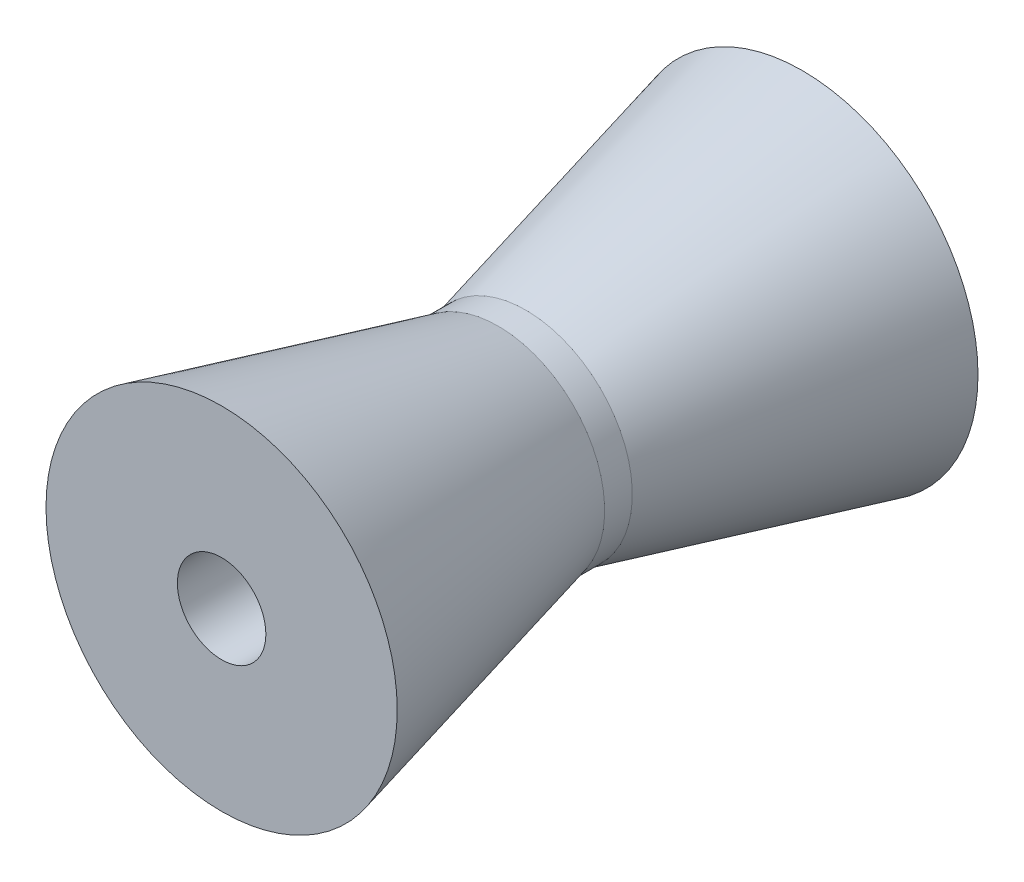
ISO-10303-21;
HEADER;
FILE_DESCRIPTION(('STEP AP214'),'2;1');
FILE_NAME('part.step','',(''),(''),'','','');
FILE_SCHEMA(('AUTOMOTIVE_DESIGN { 1 0 10303 214 1 1 1 1 }'));
ENDSEC;
DATA;
#1=APPLICATION_CONTEXT('core data for automotive mechanical design processes');
#2=APPLICATION_PROTOCOL_DEFINITION('international standard','automotive_design',2000,#1);
#3=PRODUCT_CONTEXT('',#1,'mechanical');
#4=PRODUCT('Part','Part','',(#3));
#5=PRODUCT_RELATED_PRODUCT_CATEGORY('part','',(#4));
#6=PRODUCT_DEFINITION_FORMATION('','',#4);
#7=PRODUCT_DEFINITION_CONTEXT('part definition',#1,'design');
#8=PRODUCT_DEFINITION('design','',#6,#7);
#9=PRODUCT_DEFINITION_SHAPE('','',#8);
#10=(LENGTH_UNIT() NAMED_UNIT(*) SI_UNIT(.MILLI.,.METRE.));
#11=(NAMED_UNIT(*) PLANE_ANGLE_UNIT() SI_UNIT($,.RADIAN.));
#12=(NAMED_UNIT(*) SI_UNIT($,.STERADIAN.) SOLID_ANGLE_UNIT());
#13=UNCERTAINTY_MEASURE_WITH_UNIT(LENGTH_MEASURE(1.E-05),#10,'distance_accuracy_value','');
#14=(GEOMETRIC_REPRESENTATION_CONTEXT(3) GLOBAL_UNCERTAINTY_ASSIGNED_CONTEXT((#13)) GLOBAL_UNIT_ASSIGNED_CONTEXT((#10,
#11,#12)) REPRESENTATION_CONTEXT('',''));
#15=CARTESIAN_POINT('',(0.,0.,0.));
#16=DIRECTION('',(0.,0.,1.));
#17=DIRECTION('',(1.,0.,0.));
#18=AXIS2_PLACEMENT_3D('',#15,#16,#17);
#19=CARTESIAN_POINT('',(0.,0.,13.335));
#20=DIRECTION('',(0.,0.,1.));
#21=DIRECTION('',(1.,0.,0.));
#22=AXIS2_PLACEMENT_3D('',#19,#20,#21);
#23=PLANE('',#22);
#24=CARTESIAN_POINT('',(0.,0.,13.335));
#25=DIRECTION('',(0.,0.,1.));
#26=DIRECTION('',(1.,0.,0.));
#27=AXIS2_PLACEMENT_3D('',#24,#25,#26);
#28=CIRCLE('',#27,2.032);
#29=CARTESIAN_POINT('',(2.032,0.,13.335));
#30=VERTEX_POINT('',#29);
#31=EDGE_CURVE('E10',#30,#30,#28,.T.);
#32=ORIENTED_EDGE('',*,*,#31,.F.);
#33=EDGE_LOOP('',(#32));
#34=FACE_BOUND('',#33,.T.);
#35=CARTESIAN_POINT('',(0.,0.,13.335));
#36=DIRECTION('',(0.,0.,-1.));
#37=DIRECTION('',(-1.,0.,0.));
#38=AXIS2_PLACEMENT_3D('',#35,#36,#37);
#39=CIRCLE('',#38,8.0645);
#40=CARTESIAN_POINT('',(-8.0645,0.,13.335));
#41=VERTEX_POINT('',#40);
#42=EDGE_CURVE('E45',#41,#41,#39,.T.);
#43=ORIENTED_EDGE('',*,*,#42,.F.);
#44=EDGE_LOOP('',(#43));
#45=FACE_BOUND('',#44,.T.);
#46=ADVANCED_FACE('F34',(#34,#45),#23,.T.);
#47=CARTESIAN_POINT('',(0.,0.,-13.335));
#48=DIRECTION('',(0.,0.,1.));
#49=DIRECTION('',(1.,0.,0.));
#50=AXIS2_PLACEMENT_3D('',#47,#48,#49);
#51=PLANE('',#50);
#52=CARTESIAN_POINT('',(0.,0.,-13.335));
#53=DIRECTION('',(0.,0.,1.));
#54=DIRECTION('',(1.,0.,0.));
#55=AXIS2_PLACEMENT_3D('',#52,#53,#54);
#56=CIRCLE('',#55,2.032);
#57=CARTESIAN_POINT('',(2.032,0.,-13.335));
#58=VERTEX_POINT('',#57);
#59=EDGE_CURVE('E38',#58,#58,#56,.T.);
#60=ORIENTED_EDGE('',*,*,#59,.T.);
#61=EDGE_LOOP('',(#60));
#62=FACE_BOUND('',#61,.T.);
#63=CARTESIAN_POINT('',(0.,0.,-13.335));
#64=DIRECTION('',(0.,0.,-1.));
#65=DIRECTION('',(-1.,0.,0.));
#66=AXIS2_PLACEMENT_3D('',#63,#64,#65);
#67=CIRCLE('',#66,8.0645);
#68=CARTESIAN_POINT('',(-8.0645,0.,-13.335));
#69=VERTEX_POINT('',#68);
#70=EDGE_CURVE('E52',#69,#69,#67,.T.);
#71=ORIENTED_EDGE('',*,*,#70,.T.);
#72=EDGE_LOOP('',(#71));
#73=FACE_BOUND('',#72,.T.);
#74=ADVANCED_FACE('F64',(#62,#73),#51,.F.);
#75=CARTESIAN_POINT('',(0.,0.,13.335));
#76=DIRECTION('',(0.,0.,-1.));
#77=DIRECTION('',(-1.,0.,0.));
#78=AXIS2_PLACEMENT_3D('',#75,#76,#77);
#79=CYLINDRICAL_SURFACE('',#78,4.8895);
#80=CARTESIAN_POINT('',(0.,0.,-0.635));
#81=DIRECTION('',(0.,0.,-1.));
#82=DIRECTION('',(-1.,0.,0.));
#83=AXIS2_PLACEMENT_3D('',#80,#81,#82);
#84=CIRCLE('',#83,4.8895);
#85=CARTESIAN_POINT('',(-4.8895,0.,-0.635));
#86=VERTEX_POINT('',#85);
#87=EDGE_CURVE('E55',#86,#86,#84,.T.);
#88=ORIENTED_EDGE('',*,*,#87,.F.);
#89=EDGE_LOOP('',(#88));
#90=FACE_BOUND('',#89,.T.);
#91=CARTESIAN_POINT('',(0.,0.,0.635));
#92=DIRECTION('',(0.,0.,-1.));
#93=DIRECTION('',(-1.,0.,0.));
#94=AXIS2_PLACEMENT_3D('',#91,#92,#93);
#95=CIRCLE('',#94,4.8895);
#96=CARTESIAN_POINT('',(-4.8895,0.,0.635));
#97=VERTEX_POINT('',#96);
#98=EDGE_CURVE('E49',#97,#97,#95,.T.);
#99=ORIENTED_EDGE('',*,*,#98,.T.);
#100=EDGE_LOOP('',(#99));
#101=FACE_BOUND('',#100,.T.);
#102=ADVANCED_FACE('F36',(#90,#101),#79,.T.);
#103=CARTESIAN_POINT('',(0.,0.,13.335));
#104=DIRECTION('',(0.,0.,-1.));
#105=DIRECTION('',(-1.,0.,0.));
#106=AXIS2_PLACEMENT_3D('',#103,#104,#105);
#107=CYLINDRICAL_SURFACE('',#106,2.032);
#108=ORIENTED_EDGE('',*,*,#31,.T.);
#109=EDGE_LOOP('',(#108));
#110=FACE_BOUND('',#109,.T.);
#111=ORIENTED_EDGE('',*,*,#59,.F.);
#112=EDGE_LOOP('',(#111));
#113=FACE_BOUND('',#112,.T.);
#114=ADVANCED_FACE('F63',(#110,#113),#107,.F.);
#115=CARTESIAN_POINT('',(0.,0.,0.635));
#116=DIRECTION('',(0.,0.,1.));
#117=DIRECTION('',(1.,0.,0.));
#118=AXIS2_PLACEMENT_3D('',#115,#116,#117);
#119=CONICAL_SURFACE('',#118,4.8895,0.244978663126864);
#120=ORIENTED_EDGE('',*,*,#42,.T.);
#121=EDGE_LOOP('',(#120));
#122=FACE_BOUND('',#121,.T.);
#123=ORIENTED_EDGE('',*,*,#98,.F.);
#124=EDGE_LOOP('',(#123));
#125=FACE_BOUND('',#124,.T.);
#126=ADVANCED_FACE('F67',(#122,#125),#119,.T.);
#127=CARTESIAN_POINT('',(0.,0.,-0.635));
#128=DIRECTION('',(0.,0.,-1.));
#129=DIRECTION('',(1.,0.,0.));
#130=AXIS2_PLACEMENT_3D('',#127,#128,#129);
#131=CONICAL_SURFACE('',#130,4.8895,0.244978663126864);
#132=ORIENTED_EDGE('',*,*,#70,.F.);
#133=EDGE_LOOP('',(#132));
#134=FACE_BOUND('',#133,.T.);
#135=ORIENTED_EDGE('',*,*,#87,.T.);
#136=EDGE_LOOP('',(#135));
#137=FACE_BOUND('',#136,.T.);
#138=ADVANCED_FACE('F59',(#134,#137),#131,.T.);
#139=CLOSED_SHELL('',(#46,#74,#102,#114,#126,#138));
#140=MANIFOLD_SOLID_BREP('B2',#139);
#141=ADVANCED_BREP_SHAPE_REPRESENTATION('',(#18,#140),#14);
#142=SHAPE_DEFINITION_REPRESENTATION(#9,#141);
ENDSEC;
END-ISO-10303-21;
